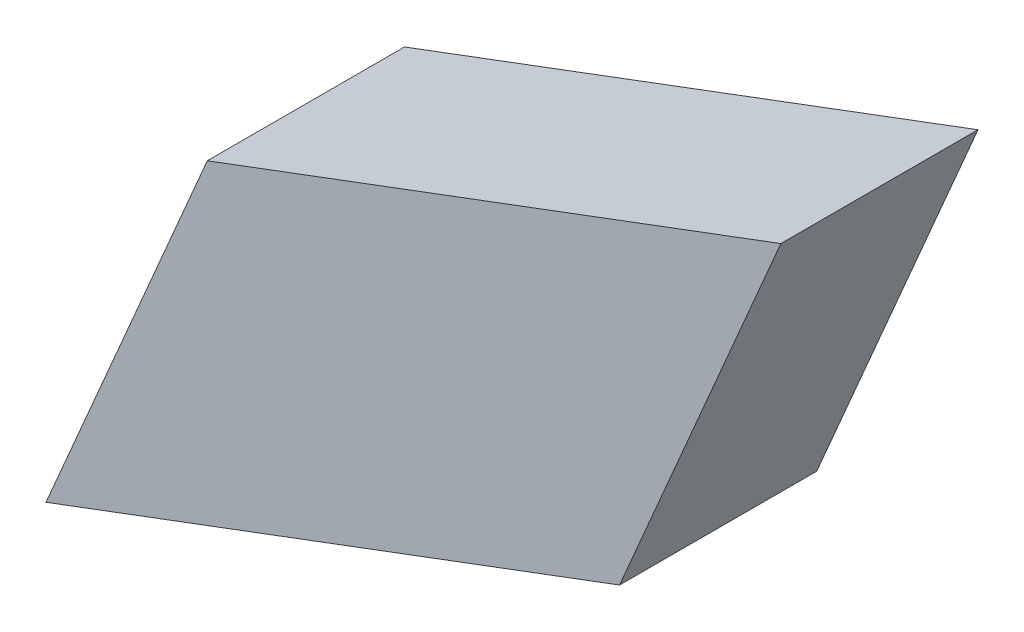
ISO-10303-21;
HEADER;
FILE_DESCRIPTION(('STEP AP214'),'2;1');
FILE_NAME('part.step','',(''),(''),'','','');
FILE_SCHEMA(('AUTOMOTIVE_DESIGN { 1 0 10303 214 1 1 1 1 }'));
ENDSEC;
DATA;
#1=APPLICATION_CONTEXT('core data for automotive mechanical design processes');
#2=APPLICATION_PROTOCOL_DEFINITION('international standard','automotive_design',2000,#1);
#3=PRODUCT_CONTEXT('',#1,'mechanical');
#4=PRODUCT('Part','Part','',(#3));
#5=PRODUCT_RELATED_PRODUCT_CATEGORY('part','',(#4));
#6=PRODUCT_DEFINITION_FORMATION('','',#4);
#7=PRODUCT_DEFINITION_CONTEXT('part definition',#1,'design');
#8=PRODUCT_DEFINITION('design','',#6,#7);
#9=PRODUCT_DEFINITION_SHAPE('','',#8);
#10=(LENGTH_UNIT() NAMED_UNIT(*) SI_UNIT(.MILLI.,.METRE.));
#11=(NAMED_UNIT(*) PLANE_ANGLE_UNIT() SI_UNIT($,.RADIAN.));
#12=(NAMED_UNIT(*) SI_UNIT($,.STERADIAN.) SOLID_ANGLE_UNIT());
#13=UNCERTAINTY_MEASURE_WITH_UNIT(LENGTH_MEASURE(1.E-05),#10,'distance_accuracy_value','');
#14=(GEOMETRIC_REPRESENTATION_CONTEXT(3) GLOBAL_UNCERTAINTY_ASSIGNED_CONTEXT((#13)) GLOBAL_UNIT_ASSIGNED_CONTEXT((#10,
#11,#12)) REPRESENTATION_CONTEXT('',''));
#15=CARTESIAN_POINT('',(0.,0.,0.));
#16=DIRECTION('',(0.,0.,1.));
#17=DIRECTION('',(1.,0.,0.));
#18=AXIS2_PLACEMENT_3D('',#15,#16,#17);
#19=CARTESIAN_POINT('',(12.,25.,11.));
#20=DIRECTION('',(0.919145030018058,-0.393919298579168,0.));
#21=DIRECTION('',(0.393919298579168,0.919145030018058,0.));
#22=AXIS2_PLACEMENT_3D('',#19,#20,#21);
#23=PLANE('',#22);
#24=DIRECTION('',(-0.393919298579168,-0.919145030018058,0.));
#25=VECTOR('',#24,1.);
#26=CARTESIAN_POINT('',(12.,25.,0.));
#27=LINE('',#26,#25);
#28=CARTESIAN_POINT('',(12.,25.,0.));
#29=VERTEX_POINT('',#28);
#30=CARTESIAN_POINT('',(3.,4.,0.));
#31=VERTEX_POINT('',#30);
#32=EDGE_CURVE('E104',#29,#31,#27,.T.);
#33=ORIENTED_EDGE('',*,*,#32,.T.);
#34=DIRECTION('',(0.,0.,-1.));
#35=VECTOR('',#34,1.);
#36=CARTESIAN_POINT('',(3.,4.,11.));
#37=LINE('',#36,#35);
#38=CARTESIAN_POINT('',(3.,4.,11.));
#39=VERTEX_POINT('',#38);
#40=EDGE_CURVE('E11',#39,#31,#37,.T.);
#41=ORIENTED_EDGE('',*,*,#40,.F.);
#42=DIRECTION('',(-0.393919298579168,-0.919145030018058,0.));
#43=VECTOR('',#42,1.);
#44=CARTESIAN_POINT('',(12.,25.,11.));
#45=LINE('',#44,#43);
#46=CARTESIAN_POINT('',(12.,25.,11.));
#47=VERTEX_POINT('',#46);
#48=EDGE_CURVE('E92',#47,#39,#45,.T.);
#49=ORIENTED_EDGE('',*,*,#48,.F.);
#50=DIRECTION('',(0.,0.,-1.));
#51=VECTOR('',#50,1.);
#52=CARTESIAN_POINT('',(12.,25.,11.));
#53=LINE('',#52,#51);
#54=EDGE_CURVE('E100',#47,#29,#53,.T.);
#55=ORIENTED_EDGE('',*,*,#54,.T.);
#56=EDGE_LOOP('',(#33,#41,#49,#55));
#57=FACE_BOUND('',#56,.T.);
#58=ADVANCED_FACE('F41',(#57),#23,.F.);
#59=CARTESIAN_POINT('',(3.,4.,11.));
#60=DIRECTION('',(-0.351123441588392,0.936329177569045,0.));
#61=DIRECTION('',(-0.936329177569044,-0.351123441588392,0.));
#62=AXIS2_PLACEMENT_3D('',#59,#60,#61);
#63=PLANE('',#62);
#64=DIRECTION('',(0.936329177569045,0.351123441588392,0.));
#65=VECTOR('',#64,1.);
#66=CARTESIAN_POINT('',(3.,4.,0.));
#67=LINE('',#66,#65);
#68=CARTESIAN_POINT('',(35.,16.,0.));
#69=VERTEX_POINT('',#68);
#70=EDGE_CURVE('E96',#31,#69,#67,.T.);
#71=ORIENTED_EDGE('',*,*,#70,.T.);
#72=DIRECTION('',(0.,0.,-1.));
#73=VECTOR('',#72,1.);
#74=CARTESIAN_POINT('',(35.,16.,11.));
#75=LINE('',#74,#73);
#76=CARTESIAN_POINT('',(35.,16.,11.));
#77=VERTEX_POINT('',#76);
#78=EDGE_CURVE('E49',#77,#69,#75,.T.);
#79=ORIENTED_EDGE('',*,*,#78,.F.);
#80=DIRECTION('',(0.936329177569045,0.351123441588392,0.));
#81=VECTOR('',#80,1.);
#82=CARTESIAN_POINT('',(3.,4.,11.));
#83=LINE('',#82,#81);
#84=EDGE_CURVE('E87',#39,#77,#83,.T.);
#85=ORIENTED_EDGE('',*,*,#84,.F.);
#86=ORIENTED_EDGE('',*,*,#40,.T.);
#87=EDGE_LOOP('',(#71,#79,#85,#86));
#88=FACE_BOUND('',#87,.T.);
#89=ADVANCED_FACE('F95',(#88),#63,.F.);
#90=CARTESIAN_POINT('',(35.,16.,11.));
#91=DIRECTION('',(-0.919145030018058,0.393919298579168,0.));
#92=DIRECTION('',(-0.393919298579168,-0.919145030018058,0.));
#93=AXIS2_PLACEMENT_3D('',#90,#91,#92);
#94=PLANE('',#93);
#95=DIRECTION('',(0.393919298579167,0.919145030018058,0.));
#96=VECTOR('',#95,1.);
#97=CARTESIAN_POINT('',(35.,16.,0.));
#98=LINE('',#97,#96);
#99=CARTESIAN_POINT('',(44.,37.,0.));
#100=VERTEX_POINT('',#99);
#101=EDGE_CURVE('E74',#69,#100,#98,.T.);
#102=ORIENTED_EDGE('',*,*,#101,.T.);
#103=DIRECTION('',(0.,0.,-1.));
#104=VECTOR('',#103,1.);
#105=CARTESIAN_POINT('',(44.,37.,11.));
#106=LINE('',#105,#104);
#107=CARTESIAN_POINT('',(44.,37.,11.));
#108=VERTEX_POINT('',#107);
#109=EDGE_CURVE('E97',#108,#100,#106,.T.);
#110=ORIENTED_EDGE('',*,*,#109,.F.);
#111=DIRECTION('',(0.393919298579167,0.919145030018058,0.));
#112=VECTOR('',#111,1.);
#113=CARTESIAN_POINT('',(35.,16.,11.));
#114=LINE('',#113,#112);
#115=EDGE_CURVE('E90',#77,#108,#114,.T.);
#116=ORIENTED_EDGE('',*,*,#115,.F.);
#117=ORIENTED_EDGE('',*,*,#78,.T.);
#118=EDGE_LOOP('',(#102,#110,#116,#117));
#119=FACE_BOUND('',#118,.T.);
#120=ADVANCED_FACE('F98',(#119),#94,.F.);
#121=CARTESIAN_POINT('',(44.,37.,11.));
#122=DIRECTION('',(0.351123441588392,-0.936329177569045,0.));
#123=DIRECTION('',(0.936329177569045,0.351123441588392,0.));
#124=AXIS2_PLACEMENT_3D('',#121,#122,#123);
#125=PLANE('',#124);
#126=DIRECTION('',(-0.936329177569045,-0.351123441588392,0.));
#127=VECTOR('',#126,1.);
#128=CARTESIAN_POINT('',(44.,37.,0.));
#129=LINE('',#128,#127);
#130=EDGE_CURVE('E80',#100,#29,#129,.T.);
#131=ORIENTED_EDGE('',*,*,#130,.T.);
#132=ORIENTED_EDGE('',*,*,#54,.F.);
#133=DIRECTION('',(-0.936329177569045,-0.351123441588392,0.));
#134=VECTOR('',#133,1.);
#135=CARTESIAN_POINT('',(44.,37.,11.));
#136=LINE('',#135,#134);
#137=EDGE_CURVE('E57',#108,#47,#136,.T.);
#138=ORIENTED_EDGE('',*,*,#137,.F.);
#139=ORIENTED_EDGE('',*,*,#109,.T.);
#140=EDGE_LOOP('',(#131,#132,#138,#139));
#141=FACE_BOUND('',#140,.T.);
#142=ADVANCED_FACE('F111',(#141),#125,.F.);
#143=CARTESIAN_POINT('',(0.,0.,11.));
#144=DIRECTION('',(0.,0.,1.));
#145=DIRECTION('',(1.,0.,0.));
#146=AXIS2_PLACEMENT_3D('',#143,#144,#145);
#147=PLANE('',#146);
#148=ORIENTED_EDGE('',*,*,#48,.T.);
#149=ORIENTED_EDGE('',*,*,#84,.T.);
#150=ORIENTED_EDGE('',*,*,#115,.T.);
#151=ORIENTED_EDGE('',*,*,#137,.T.);
#152=EDGE_LOOP('',(#148,#149,#150,#151));
#153=FACE_BOUND('',#152,.T.);
#154=ADVANCED_FACE('F88',(#153),#147,.T.);
#155=CARTESIAN_POINT('',(0.,0.,0.));
#156=DIRECTION('',(0.,0.,1.));
#157=DIRECTION('',(1.,0.,0.));
#158=AXIS2_PLACEMENT_3D('',#155,#156,#157);
#159=PLANE('',#158);
#160=ORIENTED_EDGE('',*,*,#32,.F.);
#161=ORIENTED_EDGE('',*,*,#130,.F.);
#162=ORIENTED_EDGE('',*,*,#101,.F.);
#163=ORIENTED_EDGE('',*,*,#70,.F.);
#164=EDGE_LOOP('',(#160,#161,#162,#163));
#165=FACE_BOUND('',#164,.T.);
#166=ADVANCED_FACE('F114',(#165),#159,.F.);
#167=CLOSED_SHELL('',(#58,#89,#120,#142,#154,#166));
#168=MANIFOLD_SOLID_BREP('B2',#167);
#169=ADVANCED_BREP_SHAPE_REPRESENTATION('',(#18,#168),#14);
#170=SHAPE_DEFINITION_REPRESENTATION(#9,#169);
ENDSEC;
END-ISO-10303-21;
